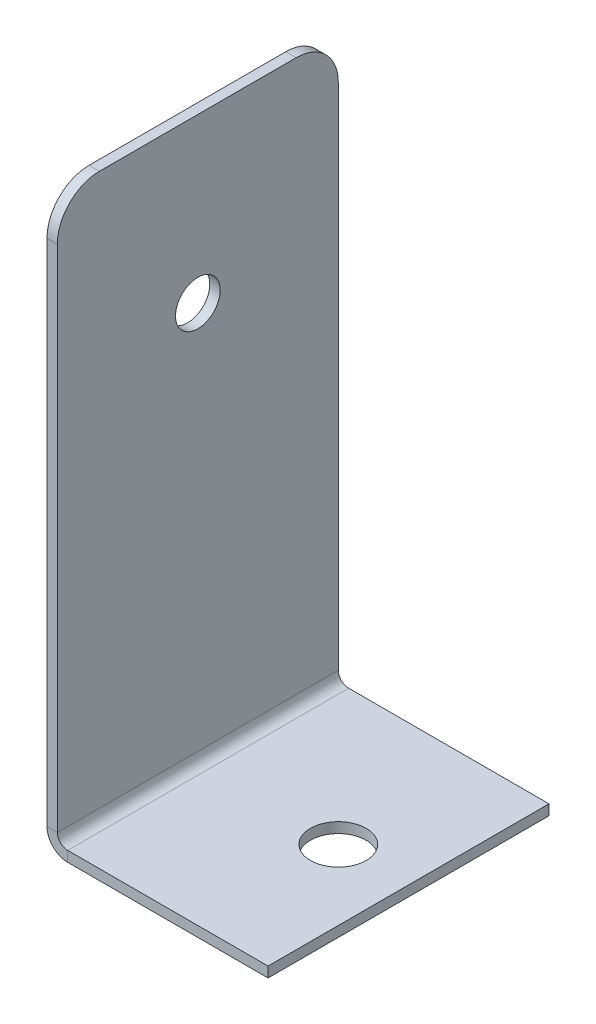
ISO-10303-21;
HEADER;
FILE_DESCRIPTION(('STEP AP214'),'2;1');
FILE_NAME('part.step','',(''),(''),'','','');
FILE_SCHEMA(('AUTOMOTIVE_DESIGN { 1 0 10303 214 1 1 1 1 }'));
ENDSEC;
DATA;
#1=APPLICATION_CONTEXT('core data for automotive mechanical design processes');
#2=APPLICATION_PROTOCOL_DEFINITION('international standard','automotive_design',2000,#1);
#3=PRODUCT_CONTEXT('',#1,'mechanical');
#4=PRODUCT('Part','Part','',(#3));
#5=PRODUCT_RELATED_PRODUCT_CATEGORY('part','',(#4));
#6=PRODUCT_DEFINITION_FORMATION('','',#4);
#7=PRODUCT_DEFINITION_CONTEXT('part definition',#1,'design');
#8=PRODUCT_DEFINITION('design','',#6,#7);
#9=PRODUCT_DEFINITION_SHAPE('','',#8);
#10=(LENGTH_UNIT() NAMED_UNIT(*) SI_UNIT(.MILLI.,.METRE.));
#11=(NAMED_UNIT(*) PLANE_ANGLE_UNIT() SI_UNIT($,.RADIAN.));
#12=(NAMED_UNIT(*) SI_UNIT($,.STERADIAN.) SOLID_ANGLE_UNIT());
#13=UNCERTAINTY_MEASURE_WITH_UNIT(LENGTH_MEASURE(1.E-05),#10,'distance_accuracy_value','');
#14=(GEOMETRIC_REPRESENTATION_CONTEXT(3) GLOBAL_UNCERTAINTY_ASSIGNED_CONTEXT((#13)) GLOBAL_UNIT_ASSIGNED_CONTEXT((#10,
#11,#12)) REPRESENTATION_CONTEXT('',''));
#15=CARTESIAN_POINT('',(0.,0.,0.));
#16=DIRECTION('',(0.,0.,1.));
#17=DIRECTION('',(1.,0.,0.));
#18=AXIS2_PLACEMENT_3D('',#15,#16,#17);
#19=CARTESIAN_POINT('',(0.736600000000087,0.,10.));
#20=DIRECTION('',(0.,0.,1.));
#21=DIRECTION('',(1.,0.,0.));
#22=AXIS2_PLACEMENT_3D('',#19,#20,#21);
#23=PLANE('',#22);
#24=DIRECTION('',(0.,-0.999999999999999,0.));
#25=VECTOR('',#24,1.);
#26=CARTESIAN_POINT('',(0.736600000000087,0.,10.));
#27=LINE('',#26,#25);
#28=CARTESIAN_POINT('',(0.736600000000087,0.,10.));
#29=VERTEX_POINT('',#28);
#30=CARTESIAN_POINT('',(0.736600000000087,-0.736600000000003,10.));
#31=VERTEX_POINT('',#30);
#32=EDGE_CURVE('E198',#29,#31,#27,.T.);
#33=ORIENTED_EDGE('',*,*,#32,.F.);
#34=CARTESIAN_POINT('',(0.736600000000087,0.736599999999995,10.));
#35=DIRECTION('',(0.,0.,-1.));
#36=DIRECTION('',(-1.,0.,0.));
#37=AXIS2_PLACEMENT_3D('',#34,#35,#36);
#38=CIRCLE('',#37,0.7366);
#39=CARTESIAN_POINT('',(0.,0.736599999999993,10.));
#40=VERTEX_POINT('',#39);
#41=EDGE_CURVE('E166',#40,#29,#38,.F.);
#42=ORIENTED_EDGE('',*,*,#41,.F.);
#43=DIRECTION('',(1.,0.,0.));
#44=VECTOR('',#43,1.);
#45=CARTESIAN_POINT('',(-0.736599999999921,0.736599999999992,10.));
#46=LINE('',#45,#44);
#47=CARTESIAN_POINT('',(-0.736599999999921,0.736599999999992,10.));
#48=VERTEX_POINT('',#47);
#49=EDGE_CURVE('E195',#48,#40,#46,.T.);
#50=ORIENTED_EDGE('',*,*,#49,.F.);
#51=CARTESIAN_POINT('',(0.736600000000087,0.736599999999995,10.));
#52=DIRECTION('',(0.,0.,1.));
#53=DIRECTION('',(1.,0.,0.));
#54=AXIS2_PLACEMENT_3D('',#51,#52,#53);
#55=CIRCLE('',#54,1.4732);
#56=EDGE_CURVE('E173',#48,#31,#55,.T.);
#57=ORIENTED_EDGE('',*,*,#56,.T.);
#58=EDGE_LOOP('',(#33,#42,#50,#57));
#59=FACE_BOUND('',#58,.T.);
#60=ADVANCED_FACE('F38',(#59),#23,.T.);
#61=CARTESIAN_POINT('',(-0.736599999999921,0.736599999999992,10.));
#62=DIRECTION('',(0.,0.,1.));
#63=DIRECTION('',(1.,0.,0.));
#64=AXIS2_PLACEMENT_3D('',#61,#62,#63);
#65=PLANE('',#64);
#66=DIRECTION('',(1.,0.,0.));
#67=VECTOR('',#66,1.);
#68=CARTESIAN_POINT('',(0.,0.,10.));
#69=LINE('',#68,#67);
#70=CARTESIAN_POINT('',(15.0000000000001,0.,10.));
#71=VERTEX_POINT('',#70);
#72=EDGE_CURVE('E163',#29,#71,#69,.T.);
#73=ORIENTED_EDGE('',*,*,#72,.F.);
#74=ORIENTED_EDGE('',*,*,#32,.T.);
#75=DIRECTION('',(1.,0.,0.));
#76=VECTOR('',#75,1.);
#77=CARTESIAN_POINT('',(0.,-0.736600000000003,10.));
#78=LINE('',#77,#76);
#79=CARTESIAN_POINT('',(15.0000000000001,-0.736600000000005,10.));
#80=VERTEX_POINT('',#79);
#81=EDGE_CURVE('E160',#31,#80,#78,.T.);
#82=ORIENTED_EDGE('',*,*,#81,.T.);
#83=DIRECTION('',(0.,-0.999999999999999,0.));
#84=VECTOR('',#83,1.);
#85=CARTESIAN_POINT('',(15.0000000000001,0.,10.));
#86=LINE('',#85,#84);
#87=EDGE_CURVE('E122',#71,#80,#86,.T.);
#88=ORIENTED_EDGE('',*,*,#87,.F.);
#89=EDGE_LOOP('',(#73,#74,#82,#88));
#90=FACE_BOUND('',#89,.T.);
#91=ADVANCED_FACE('F245',(#90),#65,.T.);
#92=CARTESIAN_POINT('',(0.,0.7366,-10.));
#93=DIRECTION('',(0.,0.,-1.));
#94=DIRECTION('',(-1.,0.,0.));
#95=AXIS2_PLACEMENT_3D('',#92,#93,#94);
#96=PLANE('',#95);
#97=DIRECTION('',(-1.,0.,0.));
#98=VECTOR('',#97,1.);
#99=CARTESIAN_POINT('',(0.,0.7366,-10.));
#100=LINE('',#99,#98);
#101=CARTESIAN_POINT('',(0.,0.7366,-10.));
#102=VERTEX_POINT('',#101);
#103=CARTESIAN_POINT('',(-0.736600000000004,0.736599999999999,-10.));
#104=VERTEX_POINT('',#103);
#105=EDGE_CURVE('E192',#102,#104,#100,.T.);
#106=ORIENTED_EDGE('',*,*,#105,.F.);
#107=CARTESIAN_POINT('',(0.736600000000004,0.736600000000001,-10.));
#108=DIRECTION('',(0.,0.,-1.));
#109=DIRECTION('',(-1.,0.,0.));
#110=AXIS2_PLACEMENT_3D('',#107,#108,#109);
#111=CIRCLE('',#110,0.7366);
#112=CARTESIAN_POINT('',(0.736600000000004,0.,-10.));
#113=VERTEX_POINT('',#112);
#114=EDGE_CURVE('E151',#102,#113,#111,.F.);
#115=ORIENTED_EDGE('',*,*,#114,.T.);
#116=DIRECTION('',(0.,0.999999999999999,0.));
#117=VECTOR('',#116,1.);
#118=CARTESIAN_POINT('',(0.736600000000004,-0.736599999999996,-10.));
#119=LINE('',#118,#117);
#120=CARTESIAN_POINT('',(0.736600000000004,-0.736599999999996,-10.));
#121=VERTEX_POINT('',#120);
#122=EDGE_CURVE('E126',#121,#113,#119,.T.);
#123=ORIENTED_EDGE('',*,*,#122,.F.);
#124=CARTESIAN_POINT('',(0.736600000000004,0.736600000000001,-10.));
#125=DIRECTION('',(0.,0.,1.));
#126=DIRECTION('',(1.,0.,0.));
#127=AXIS2_PLACEMENT_3D('',#124,#125,#126);
#128=CIRCLE('',#127,1.4732);
#129=EDGE_CURVE('E158',#104,#121,#128,.T.);
#130=ORIENTED_EDGE('',*,*,#129,.F.);
#131=EDGE_LOOP('',(#106,#115,#123,#130));
#132=FACE_BOUND('',#131,.T.);
#133=ADVANCED_FACE('F247',(#132),#96,.T.);
#134=CARTESIAN_POINT('',(0.736600000000004,-0.736599999999996,-10.));
#135=DIRECTION('',(0.,0.,-1.));
#136=DIRECTION('',(-1.,0.,0.));
#137=AXIS2_PLACEMENT_3D('',#134,#135,#136);
#138=PLANE('',#137);
#139=DIRECTION('',(0.,-0.999999999999999,0.));
#140=VECTOR('',#139,1.);
#141=CARTESIAN_POINT('',(-0.736599999999921,40.,-10.));
#142=LINE('',#141,#140);
#143=CARTESIAN_POINT('',(-0.736599999999921,37.,-10.));
#144=VERTEX_POINT('',#143);
#145=EDGE_CURVE('E156',#144,#104,#142,.T.);
#146=ORIENTED_EDGE('',*,*,#145,.F.);
#147=DIRECTION('',(1.,0.,0.));
#148=VECTOR('',#147,1.);
#149=CARTESIAN_POINT('',(0.736600000000004,37.,-10.));
#150=LINE('',#149,#148);
#151=CARTESIAN_POINT('',(0.,37.,-10.));
#152=VERTEX_POINT('',#151);
#153=EDGE_CURVE('E199',#144,#152,#150,.T.);
#154=ORIENTED_EDGE('',*,*,#153,.T.);
#155=DIRECTION('',(0.,-0.999999999999999,0.));
#156=VECTOR('',#155,1.);
#157=CARTESIAN_POINT('',(0.,40.,-10.));
#158=LINE('',#157,#156);
#159=EDGE_CURVE('E154',#152,#102,#158,.T.);
#160=ORIENTED_EDGE('',*,*,#159,.T.);
#161=ORIENTED_EDGE('',*,*,#105,.T.);
#162=EDGE_LOOP('',(#146,#154,#160,#161));
#163=FACE_BOUND('',#162,.T.);
#164=ADVANCED_FACE('F220',(#163),#138,.T.);
#165=CARTESIAN_POINT('',(0.,-0.736600000000003,10.));
#166=DIRECTION('',(0.,0.999999999999999,0.));
#167=DIRECTION('',(0.,0.,1.));
#168=AXIS2_PLACEMENT_3D('',#165,#166,#167);
#169=PLANE('',#168);
#170=CARTESIAN_POINT('',(10.0000000000001,-0.736600000000001,0.));
#171=DIRECTION('',(0.,0.999999999999999,0.));
#172=DIRECTION('',(0.,0.,1.));
#173=AXIS2_PLACEMENT_3D('',#170,#171,#172);
#174=CIRCLE('',#173,1.984375);
#175=CARTESIAN_POINT('',(10.0000000000001,-0.736600000000002,1.984375));
#176=VERTEX_POINT('',#175);
#177=EDGE_CURVE('E436',#176,#176,#174,.T.);
#178=ORIENTED_EDGE('',*,*,#177,.T.);
#179=EDGE_LOOP('',(#178));
#180=FACE_BOUND('',#179,.T.);
#181=DIRECTION('',(0.,0.,-1.));
#182=VECTOR('',#181,1.);
#183=CARTESIAN_POINT('',(0.736600000000087,-0.736600000000003,10.));
#184=LINE('',#183,#182);
#185=EDGE_CURVE('E141',#31,#121,#184,.T.);
#186=ORIENTED_EDGE('',*,*,#185,.T.);
#187=DIRECTION('',(1.,0.,0.));
#188=VECTOR('',#187,1.);
#189=CARTESIAN_POINT('',(0.,-0.736599999999996,-10.));
#190=LINE('',#189,#188);
#191=CARTESIAN_POINT('',(15.0000000000001,-0.736599999999999,-10.));
#192=VERTEX_POINT('',#191);
#193=EDGE_CURVE('E133',#121,#192,#190,.T.);
#194=ORIENTED_EDGE('',*,*,#193,.T.);
#195=DIRECTION('',(0.,0.,-1.));
#196=VECTOR('',#195,1.);
#197=CARTESIAN_POINT('',(15.0000000000001,-0.736600000000005,10.));
#198=LINE('',#197,#196);
#199=EDGE_CURVE('E117',#80,#192,#198,.T.);
#200=ORIENTED_EDGE('',*,*,#199,.F.);
#201=ORIENTED_EDGE('',*,*,#81,.F.);
#202=EDGE_LOOP('',(#186,#194,#200,#201));
#203=FACE_BOUND('',#202,.T.);
#204=ADVANCED_FACE('F139',(#180,#203),#169,.F.);
#205=CARTESIAN_POINT('',(15.0000000000001,0.,10.));
#206=DIRECTION('',(1.,0.,0.));
#207=DIRECTION('',(0.,0.,-1.));
#208=AXIS2_PLACEMENT_3D('',#205,#206,#207);
#209=PLANE('',#208);
#210=ORIENTED_EDGE('',*,*,#199,.T.);
#211=DIRECTION('',(0.,-0.999999999999999,0.));
#212=VECTOR('',#211,1.);
#213=CARTESIAN_POINT('',(15.0000000000001,0.,-10.));
#214=LINE('',#213,#212);
#215=CARTESIAN_POINT('',(15.0000000000001,0.,-10.));
#216=VERTEX_POINT('',#215);
#217=EDGE_CURVE('E120',#216,#192,#214,.T.);
#218=ORIENTED_EDGE('',*,*,#217,.F.);
#219=DIRECTION('',(0.,0.,-1.));
#220=VECTOR('',#219,1.);
#221=CARTESIAN_POINT('',(15.0000000000001,0.,10.));
#222=LINE('',#221,#220);
#223=EDGE_CURVE('E127',#71,#216,#222,.T.);
#224=ORIENTED_EDGE('',*,*,#223,.F.);
#225=ORIENTED_EDGE('',*,*,#87,.T.);
#226=EDGE_LOOP('',(#210,#218,#224,#225));
#227=FACE_BOUND('',#226,.T.);
#228=ADVANCED_FACE('F119',(#227),#209,.T.);
#229=CARTESIAN_POINT('',(0.,0.,10.));
#230=DIRECTION('',(0.,0.999999999999999,0.));
#231=DIRECTION('',(0.,0.,1.));
#232=AXIS2_PLACEMENT_3D('',#229,#230,#231);
#233=PLANE('',#232);
#234=CARTESIAN_POINT('',(10.0000000000001,0.,0.));
#235=DIRECTION('',(0.,0.999999999999999,0.));
#236=DIRECTION('',(0.,0.,1.));
#237=AXIS2_PLACEMENT_3D('',#234,#235,#236);
#238=CIRCLE('',#237,1.984375);
#239=CARTESIAN_POINT('',(10.0000000000001,0.,1.984375));
#240=VERTEX_POINT('',#239);
#241=EDGE_CURVE('E437',#240,#240,#238,.T.);
#242=ORIENTED_EDGE('',*,*,#241,.F.);
#243=EDGE_LOOP('',(#242));
#244=FACE_BOUND('',#243,.T.);
#245=ORIENTED_EDGE('',*,*,#223,.T.);
#246=DIRECTION('',(1.,0.,0.));
#247=VECTOR('',#246,1.);
#248=CARTESIAN_POINT('',(0.,0.,-10.));
#249=LINE('',#248,#247);
#250=EDGE_CURVE('E136',#113,#216,#249,.T.);
#251=ORIENTED_EDGE('',*,*,#250,.F.);
#252=DIRECTION('',(0.,0.,-1.));
#253=VECTOR('',#252,1.);
#254=CARTESIAN_POINT('',(0.736600000000087,0.,10.));
#255=LINE('',#254,#253);
#256=EDGE_CURVE('E187',#29,#113,#255,.T.);
#257=ORIENTED_EDGE('',*,*,#256,.F.);
#258=ORIENTED_EDGE('',*,*,#72,.T.);
#259=EDGE_LOOP('',(#245,#251,#257,#258));
#260=FACE_BOUND('',#259,.T.);
#261=ADVANCED_FACE('F244',(#244,#260),#233,.T.);
#262=CARTESIAN_POINT('',(0.736600000000087,0.736599999999995,10.));
#263=DIRECTION('',(0.,0.,-1.));
#264=DIRECTION('',(-1.,0.,0.));
#265=AXIS2_PLACEMENT_3D('',#262,#263,#264);
#266=CYLINDRICAL_SURFACE('',#265,0.7366);
#267=ORIENTED_EDGE('',*,*,#256,.T.);
#268=ORIENTED_EDGE('',*,*,#114,.F.);
#269=DIRECTION('',(0.,0.,-1.));
#270=VECTOR('',#269,1.);
#271=CARTESIAN_POINT('',(0.,0.736599999999993,10.));
#272=LINE('',#271,#270);
#273=EDGE_CURVE('E184',#40,#102,#272,.T.);
#274=ORIENTED_EDGE('',*,*,#273,.F.);
#275=ORIENTED_EDGE('',*,*,#41,.T.);
#276=EDGE_LOOP('',(#267,#268,#274,#275));
#277=FACE_BOUND('',#276,.T.);
#278=ADVANCED_FACE('F238',(#277),#266,.F.);
#279=CARTESIAN_POINT('',(0.,40.,9.99999999999999));
#280=DIRECTION('',(1.,0.,0.));
#281=DIRECTION('',(0.,0.999999999999999,0.));
#282=AXIS2_PLACEMENT_3D('',#279,#280,#281);
#283=PLANE('',#282);
#284=CARTESIAN_POINT('',(0.,28.3734,0.));
#285=DIRECTION('',(1.,0.,0.));
#286=DIRECTION('',(0.,0.999999999999999,0.));
#287=AXIS2_PLACEMENT_3D('',#284,#285,#286);
#288=CIRCLE('',#287,1.5875);
#289=CARTESIAN_POINT('',(0.,29.9609,0.));
#290=VERTEX_POINT('',#289);
#291=EDGE_CURVE('E145',#290,#290,#288,.T.);
#292=ORIENTED_EDGE('',*,*,#291,.F.);
#293=EDGE_LOOP('',(#292));
#294=FACE_BOUND('',#293,.T.);
#295=ORIENTED_EDGE('',*,*,#159,.F.);
#296=CARTESIAN_POINT('',(0.,37.,-7.00000000000002));
#297=DIRECTION('',(1.,0.,0.));
#298=DIRECTION('',(0.,0.999999999999999,0.));
#299=AXIS2_PLACEMENT_3D('',#296,#297,#298);
#300=CIRCLE('',#299,3.);
#301=CARTESIAN_POINT('',(0.,40.,-7.00000000000002));
#302=VERTEX_POINT('',#301);
#303=EDGE_CURVE('E205',#152,#302,#300,.T.);
#304=ORIENTED_EDGE('',*,*,#303,.T.);
#305=DIRECTION('',(0.,0.,-1.));
#306=VECTOR('',#305,1.);
#307=CARTESIAN_POINT('',(0.,40.,9.99999999999999));
#308=LINE('',#307,#306);
#309=CARTESIAN_POINT('',(0.,40.,6.99999999999999));
#310=VERTEX_POINT('',#309);
#311=EDGE_CURVE('E182',#310,#302,#308,.T.);
#312=ORIENTED_EDGE('',*,*,#311,.F.);
#313=CARTESIAN_POINT('',(0.,37.,6.99999999999999));
#314=DIRECTION('',(1.,0.,0.));
#315=DIRECTION('',(0.,0.999999999999999,0.));
#316=AXIS2_PLACEMENT_3D('',#313,#314,#315);
#317=CIRCLE('',#316,3.);
#318=CARTESIAN_POINT('',(0.,37.,9.99999999999999));
#319=VERTEX_POINT('',#318);
#320=EDGE_CURVE('E203',#310,#319,#317,.T.);
#321=ORIENTED_EDGE('',*,*,#320,.T.);
#322=DIRECTION('',(0.,-0.999999999999999,0.));
#323=VECTOR('',#322,1.);
#324=CARTESIAN_POINT('',(0.,40.,9.99999999999999));
#325=LINE('',#324,#323);
#326=EDGE_CURVE('E169',#319,#40,#325,.T.);
#327=ORIENTED_EDGE('',*,*,#326,.T.);
#328=ORIENTED_EDGE('',*,*,#273,.T.);
#329=EDGE_LOOP('',(#295,#304,#312,#321,#327,#328));
#330=FACE_BOUND('',#329,.T.);
#331=ADVANCED_FACE('F226',(#294,#330),#283,.T.);
#332=CARTESIAN_POINT('',(-0.736600000000004,40.,10.));
#333=DIRECTION('',(0.,0.999999999999999,0.));
#334=DIRECTION('',(0.,0.,1.));
#335=AXIS2_PLACEMENT_3D('',#332,#333,#334);
#336=PLANE('',#335);
#337=ORIENTED_EDGE('',*,*,#311,.T.);
#338=DIRECTION('',(1.,0.,0.));
#339=VECTOR('',#338,1.);
#340=CARTESIAN_POINT('',(-0.736599999999921,40.,-7.00000000000001));
#341=LINE('',#340,#339);
#342=CARTESIAN_POINT('',(-0.736599999999921,40.,-7.00000000000001));
#343=VERTEX_POINT('',#342);
#344=EDGE_CURVE('E59',#302,#343,#341,.F.);
#345=ORIENTED_EDGE('',*,*,#344,.T.);
#346=DIRECTION('',(0.,0.,-1.));
#347=VECTOR('',#346,1.);
#348=CARTESIAN_POINT('',(-0.736600000000004,40.,10.));
#349=LINE('',#348,#347);
#350=CARTESIAN_POINT('',(-0.736600000000004,40.,7.));
#351=VERTEX_POINT('',#350);
#352=EDGE_CURVE('E180',#351,#343,#349,.T.);
#353=ORIENTED_EDGE('',*,*,#352,.F.);
#354=DIRECTION('',(1.,0.,0.));
#355=VECTOR('',#354,1.);
#356=CARTESIAN_POINT('',(0.,40.,6.99999999999999));
#357=LINE('',#356,#355);
#358=EDGE_CURVE('E207',#351,#310,#357,.T.);
#359=ORIENTED_EDGE('',*,*,#358,.T.);
#360=EDGE_LOOP('',(#337,#345,#353,#359));
#361=FACE_BOUND('',#360,.T.);
#362=ADVANCED_FACE('F227',(#361),#336,.T.);
#363=CARTESIAN_POINT('',(-0.736600000000004,40.,10.));
#364=DIRECTION('',(1.,0.,0.));
#365=DIRECTION('',(0.,0.999999999999999,0.));
#366=AXIS2_PLACEMENT_3D('',#363,#364,#365);
#367=PLANE('',#366);
#368=CARTESIAN_POINT('',(-0.736599999999948,28.3734,0.));
#369=DIRECTION('',(1.,0.,0.));
#370=DIRECTION('',(0.,0.999999999999999,0.));
#371=AXIS2_PLACEMENT_3D('',#368,#369,#370);
#372=CIRCLE('',#371,1.5875);
#373=CARTESIAN_POINT('',(-0.736599999999949,29.9609,0.));
#374=VERTEX_POINT('',#373);
#375=EDGE_CURVE('E142',#374,#374,#372,.T.);
#376=ORIENTED_EDGE('',*,*,#375,.T.);
#377=EDGE_LOOP('',(#376));
#378=FACE_BOUND('',#377,.T.);
#379=ORIENTED_EDGE('',*,*,#352,.T.);
#380=CARTESIAN_POINT('',(-0.736599999999921,37.,-7.00000000000001));
#381=DIRECTION('',(1.,0.,0.));
#382=DIRECTION('',(0.,0.999999999999999,0.));
#383=AXIS2_PLACEMENT_3D('',#380,#381,#382);
#384=CIRCLE('',#383,3.);
#385=EDGE_CURVE('E46',#343,#144,#384,.F.);
#386=ORIENTED_EDGE('',*,*,#385,.T.);
#387=ORIENTED_EDGE('',*,*,#145,.T.);
#388=DIRECTION('',(0.,0.,-1.));
#389=VECTOR('',#388,1.);
#390=CARTESIAN_POINT('',(-0.736599999999921,0.736599999999992,10.));
#391=LINE('',#390,#389);
#392=EDGE_CURVE('E177',#48,#104,#391,.T.);
#393=ORIENTED_EDGE('',*,*,#392,.F.);
#394=DIRECTION('',(0.,-0.999999999999999,0.));
#395=VECTOR('',#394,1.);
#396=CARTESIAN_POINT('',(-0.736600000000004,40.,10.));
#397=LINE('',#396,#395);
#398=CARTESIAN_POINT('',(-0.736600000000004,37.,10.));
#399=VERTEX_POINT('',#398);
#400=EDGE_CURVE('E171',#399,#48,#397,.T.);
#401=ORIENTED_EDGE('',*,*,#400,.F.);
#402=CARTESIAN_POINT('',(-0.736600000000004,37.,6.99999999999999));
#403=DIRECTION('',(1.,0.,0.));
#404=DIRECTION('',(0.,0.999999999999999,0.));
#405=AXIS2_PLACEMENT_3D('',#402,#403,#404);
#406=CIRCLE('',#405,3.);
#407=EDGE_CURVE('E211',#399,#351,#406,.F.);
#408=ORIENTED_EDGE('',*,*,#407,.T.);
#409=EDGE_LOOP('',(#379,#386,#387,#393,#401,#408));
#410=FACE_BOUND('',#409,.T.);
#411=ADVANCED_FACE('F215',(#378,#410),#367,.F.);
#412=CARTESIAN_POINT('',(0.736600000000087,0.736599999999995,10.));
#413=DIRECTION('',(0.,0.,-1.));
#414=DIRECTION('',(-1.,0.,0.));
#415=AXIS2_PLACEMENT_3D('',#412,#413,#414);
#416=CYLINDRICAL_SURFACE('',#415,1.4732);
#417=ORIENTED_EDGE('',*,*,#392,.T.);
#418=ORIENTED_EDGE('',*,*,#129,.T.);
#419=ORIENTED_EDGE('',*,*,#185,.F.);
#420=ORIENTED_EDGE('',*,*,#56,.F.);
#421=EDGE_LOOP('',(#417,#418,#419,#420));
#422=FACE_BOUND('',#421,.T.);
#423=ADVANCED_FACE('F278',(#422),#416,.T.);
#424=CARTESIAN_POINT('',(0.736600000000087,0.736599999999995,10.));
#425=DIRECTION('',(0.,0.,-1.));
#426=DIRECTION('',(-1.,0.,0.));
#427=AXIS2_PLACEMENT_3D('',#424,#425,#426);
#428=PLANE('',#427);
#429=ORIENTED_EDGE('',*,*,#326,.F.);
#430=DIRECTION('',(1.,0.,0.));
#431=VECTOR('',#430,1.);
#432=CARTESIAN_POINT('',(-0.736600000000004,37.,10.));
#433=LINE('',#432,#431);
#434=EDGE_CURVE('E11',#319,#399,#433,.F.);
#435=ORIENTED_EDGE('',*,*,#434,.T.);
#436=ORIENTED_EDGE('',*,*,#400,.T.);
#437=ORIENTED_EDGE('',*,*,#49,.T.);
#438=EDGE_LOOP('',(#429,#435,#436,#437));
#439=FACE_BOUND('',#438,.T.);
#440=ADVANCED_FACE('F231',(#439),#428,.F.);
#441=CARTESIAN_POINT('',(0.736600000000004,0.736600000000001,-10.));
#442=DIRECTION('',(0.,0.,-1.));
#443=DIRECTION('',(-1.,0.,0.));
#444=AXIS2_PLACEMENT_3D('',#441,#442,#443);
#445=PLANE('',#444);
#446=ORIENTED_EDGE('',*,*,#193,.F.);
#447=ORIENTED_EDGE('',*,*,#122,.T.);
#448=ORIENTED_EDGE('',*,*,#250,.T.);
#449=ORIENTED_EDGE('',*,*,#217,.T.);
#450=EDGE_LOOP('',(#446,#447,#448,#449));
#451=FACE_BOUND('',#450,.T.);
#452=ADVANCED_FACE('F132',(#451),#445,.T.);
#453=CARTESIAN_POINT('',(-9.99999999999997,28.3734,0.));
#454=DIRECTION('',(1.,0.,0.));
#455=DIRECTION('',(0.,0.999999999999999,0.));
#456=AXIS2_PLACEMENT_3D('',#453,#454,#455);
#457=CYLINDRICAL_SURFACE('',#456,1.5875);
#458=ORIENTED_EDGE('',*,*,#291,.T.);
#459=EDGE_LOOP('',(#458));
#460=FACE_BOUND('',#459,.T.);
#461=ORIENTED_EDGE('',*,*,#375,.F.);
#462=EDGE_LOOP('',(#461));
#463=FACE_BOUND('',#462,.T.);
#464=ADVANCED_FACE('F263',(#460,#463),#457,.F.);
#465=CARTESIAN_POINT('',(10.0000000000001,-9.99999999999999,0.));
#466=DIRECTION('',(0.,0.999999999999999,0.));
#467=DIRECTION('',(0.,0.,1.));
#468=AXIS2_PLACEMENT_3D('',#465,#466,#467);
#469=CYLINDRICAL_SURFACE('',#468,1.984375);
#470=CARTESIAN_POINT('',(10.0000000000001,0.,1.984375));
#471=CARTESIAN_POINT('',(10.0000000000001,-0.00767291666666815,1.984375));
#472=CARTESIAN_POINT('',(10.0000000000001,-0.0153458333333346,1.984375));
#473=CARTESIAN_POINT('',(10.0000000000001,-0.030691666666668,1.984375));
#474=CARTESIAN_POINT('',(10.0000000000001,-0.038364583333335,1.984375));
#475=CARTESIAN_POINT('',(10.0000000000001,-0.0537104166666684,1.984375));
#476=CARTESIAN_POINT('',(10.0000000000001,-0.0613833333333348,1.984375));
#477=CARTESIAN_POINT('',(10.0000000000001,-0.0767291666666682,1.984375));
#478=CARTESIAN_POINT('',(10.0000000000001,-0.0844020833333352,1.984375));
#479=CARTESIAN_POINT('',(10.0000000000001,-0.0997479166666686,1.984375));
#480=CARTESIAN_POINT('',(10.0000000000001,-0.107420833333335,1.984375));
#481=CARTESIAN_POINT('',(10.0000000000001,-0.122766666666668,1.984375));
#482=CARTESIAN_POINT('',(10.0000000000001,-0.130439583333335,1.984375));
#483=CARTESIAN_POINT('',(10.0000000000001,-0.145785416666669,1.984375));
#484=CARTESIAN_POINT('',(10.0000000000001,-0.153458333333335,1.984375));
#485=CARTESIAN_POINT('',(10.0000000000001,-0.168804166666669,1.984375));
#486=CARTESIAN_POINT('',(10.0000000000001,-0.176477083333336,1.984375));
#487=CARTESIAN_POINT('',(10.0000000000001,-0.191822916666669,1.984375));
#488=CARTESIAN_POINT('',(10.0000000000001,-0.199495833333336,1.984375));
#489=CARTESIAN_POINT('',(10.0000000000001,-0.214841666666668,1.984375));
#490=CARTESIAN_POINT('',(10.0000000000001,-0.222514583333335,1.984375));
#491=CARTESIAN_POINT('',(10.0000000000001,-0.237860416666668,1.984375));
#492=CARTESIAN_POINT('',(10.0000000000001,-0.245533333333335,1.984375));
#493=CARTESIAN_POINT('',(10.0000000000001,-0.260879166666669,1.984375));
#494=CARTESIAN_POINT('',(10.0000000000001,-0.268552083333335,1.984375));
#495=CARTESIAN_POINT('',(10.0000000000001,-0.283897916666668,1.984375));
#496=CARTESIAN_POINT('',(10.0000000000001,-0.291570833333335,1.984375));
#497=CARTESIAN_POINT('',(10.0000000000001,-0.306916666666669,1.984375));
#498=CARTESIAN_POINT('',(10.0000000000001,-0.314589583333335,1.984375));
#499=CARTESIAN_POINT('',(10.0000000000001,-0.329935416666669,1.984375));
#500=CARTESIAN_POINT('',(10.0000000000001,-0.337608333333336,1.984375));
#501=CARTESIAN_POINT('',(10.0000000000001,-0.352954166666669,1.984375));
#502=CARTESIAN_POINT('',(10.0000000000001,-0.360627083333336,1.984375));
#503=CARTESIAN_POINT('',(10.0000000000001,-0.375972916666668,1.984375));
#504=CARTESIAN_POINT('',(10.0000000000001,-0.383645833333335,1.984375));
#505=CARTESIAN_POINT('',(10.0000000000001,-0.398991666666668,1.984375));
#506=CARTESIAN_POINT('',(10.0000000000001,-0.406664583333335,1.984375));
#507=CARTESIAN_POINT('',(10.0000000000001,-0.422010416666669,1.984375));
#508=CARTESIAN_POINT('',(10.0000000000001,-0.429683333333335,1.984375));
#509=CARTESIAN_POINT('',(10.0000000000001,-0.445029166666668,1.984375));
#510=CARTESIAN_POINT('',(10.0000000000001,-0.452702083333335,1.984375));
#511=CARTESIAN_POINT('',(10.0000000000001,-0.468047916666669,1.984375));
#512=CARTESIAN_POINT('',(10.0000000000001,-0.475720833333335,1.984375));
#513=CARTESIAN_POINT('',(10.0000000000001,-0.491066666666669,1.984375));
#514=CARTESIAN_POINT('',(10.0000000000001,-0.498739583333336,1.984375));
#515=CARTESIAN_POINT('',(10.0000000000001,-0.514085416666669,1.984375));
#516=CARTESIAN_POINT('',(10.0000000000001,-0.521758333333336,1.984375));
#517=CARTESIAN_POINT('',(10.0000000000001,-0.537104166666668,1.984375));
#518=CARTESIAN_POINT('',(10.0000000000001,-0.544777083333335,1.984375));
#519=CARTESIAN_POINT('',(10.0000000000001,-0.560122916666668,1.984375));
#520=CARTESIAN_POINT('',(10.0000000000001,-0.567795833333335,1.984375));
#521=CARTESIAN_POINT('',(10.0000000000001,-0.583141666666669,1.984375));
#522=CARTESIAN_POINT('',(10.0000000000001,-0.590814583333335,1.984375));
#523=CARTESIAN_POINT('',(10.0000000000001,-0.606160416666668,1.984375));
#524=CARTESIAN_POINT('',(10.0000000000001,-0.613833333333335,1.984375));
#525=CARTESIAN_POINT('',(10.0000000000001,-0.629179166666669,1.984375));
#526=CARTESIAN_POINT('',(10.0000000000001,-0.636852083333335,1.984375));
#527=CARTESIAN_POINT('',(10.0000000000001,-0.652197916666669,1.984375));
#528=CARTESIAN_POINT('',(10.0000000000001,-0.659870833333336,1.984375));
#529=CARTESIAN_POINT('',(10.0000000000001,-0.675216666666669,1.984375));
#530=CARTESIAN_POINT('',(10.0000000000001,-0.682889583333335,1.984375));
#531=CARTESIAN_POINT('',(10.0000000000001,-0.698235416666669,1.984375));
#532=CARTESIAN_POINT('',(10.0000000000001,-0.705908333333336,1.984375));
#533=CARTESIAN_POINT('',(10.0000000000001,-0.721254166666669,1.984375));
#534=CARTESIAN_POINT('',(10.0000000000001,-0.728927083333336,1.984375));
#535=CARTESIAN_POINT('',(10.0000000000001,-0.736600000000002,1.984375));
#536=B_SPLINE_CURVE_WITH_KNOTS('',3,(#470,#471,#472,#473,#474,#475,#476,#477,#478,#479,#480,
#481,#482,#483,#484,#485,#486,#487,#488,#489,#490,#491,#492,#493,#494,#495,#496,#497,#498,#499,
#500,#501,#502,#503,#504,#505,#506,#507,#508,#509,#510,#511,#512,#513,#514,#515,#516,#517,#518,
#519,#520,#521,#522,#523,#524,#525,#526,#527,#528,#529,#530,#531,#532,#533,#534,#535),
.UNSPECIFIED.,.F.,.F.,(4,2,2,2,2,2,2,2,2,2,2,2,2,2,2,2,2,2,2,2,2,2,2,2,2,2,2,2,2,2,2,2,4),(0.,
0.0230187499999993,0.0460375000000002,0.0690562499999995,0.0920750000000005,0.11509375,
0.138112500000001,0.16113125,0.184150000000001,0.20716875,0.230187499999999,0.25320625,0.276225,
0.299243750000001,0.3222625,0.345281250000001,0.3683,0.391318749999999,0.4143375,0.43735625,
0.460375000000001,0.48339375,0.506412500000001,0.52943125,0.552449999999999,0.57546875,
0.5984875,0.621506250000001,0.644525,0.667543750000001,0.6905625,0.713581250000001,0.7366),.UNSPECIFIED.);
#537=EDGE_CURVE('BSEAM258',#240,#176,#536,.T.);
#538=ORIENTED_EDGE('',*,*,#241,.T.);
#539=ORIENTED_EDGE('',*,*,#177,.F.);
#540=ORIENTED_EDGE('',*,*,#537,.T.);
#541=ORIENTED_EDGE('',*,*,#537,.F.);
#542=EDGE_LOOP('',(#538,#540,#539,#541));
#543=FACE_BOUND('',#542,.T.);
#544=ADVANCED_FACE('F258',(#543),#469,.F.);
#545=CARTESIAN_POINT('',(0.736600000000087,37.,-7.00000000000001));
#546=DIRECTION('',(1.,0.,0.));
#547=DIRECTION('',(0.,0.,-1.));
#548=AXIS2_PLACEMENT_3D('',#545,#546,#547);
#549=CYLINDRICAL_SURFACE('',#548,3.);
#550=ORIENTED_EDGE('',*,*,#385,.F.);
#551=ORIENTED_EDGE('',*,*,#344,.F.);
#552=ORIENTED_EDGE('',*,*,#303,.F.);
#553=ORIENTED_EDGE('',*,*,#153,.F.);
#554=EDGE_LOOP('',(#550,#551,#552,#553));
#555=FACE_BOUND('',#554,.T.);
#556=ADVANCED_FACE('F223',(#555),#549,.T.);
#557=CARTESIAN_POINT('',(-0.736600000000004,37.,6.99999999999999));
#558=DIRECTION('',(-1.,0.,0.));
#559=DIRECTION('',(0.,0.,1.));
#560=AXIS2_PLACEMENT_3D('',#557,#558,#559);
#561=CYLINDRICAL_SURFACE('',#560,3.);
#562=ORIENTED_EDGE('',*,*,#407,.F.);
#563=ORIENTED_EDGE('',*,*,#434,.F.);
#564=ORIENTED_EDGE('',*,*,#320,.F.);
#565=ORIENTED_EDGE('',*,*,#358,.F.);
#566=EDGE_LOOP('',(#562,#563,#564,#565));
#567=FACE_BOUND('',#566,.T.);
#568=ADVANCED_FACE('F40',(#567),#561,.T.);
#569=CLOSED_SHELL('',(#60,#91,#133,#164,#204,#228,#261,#278,#331,#362,#411,#423,#440,#452,#464,
#544,#556,#568));
#570=MANIFOLD_SOLID_BREP('B2',#569);
#571=ADVANCED_BREP_SHAPE_REPRESENTATION('',(#18,#570),#14);
#572=SHAPE_DEFINITION_REPRESENTATION(#9,#571);
ENDSEC;
END-ISO-10303-21;
